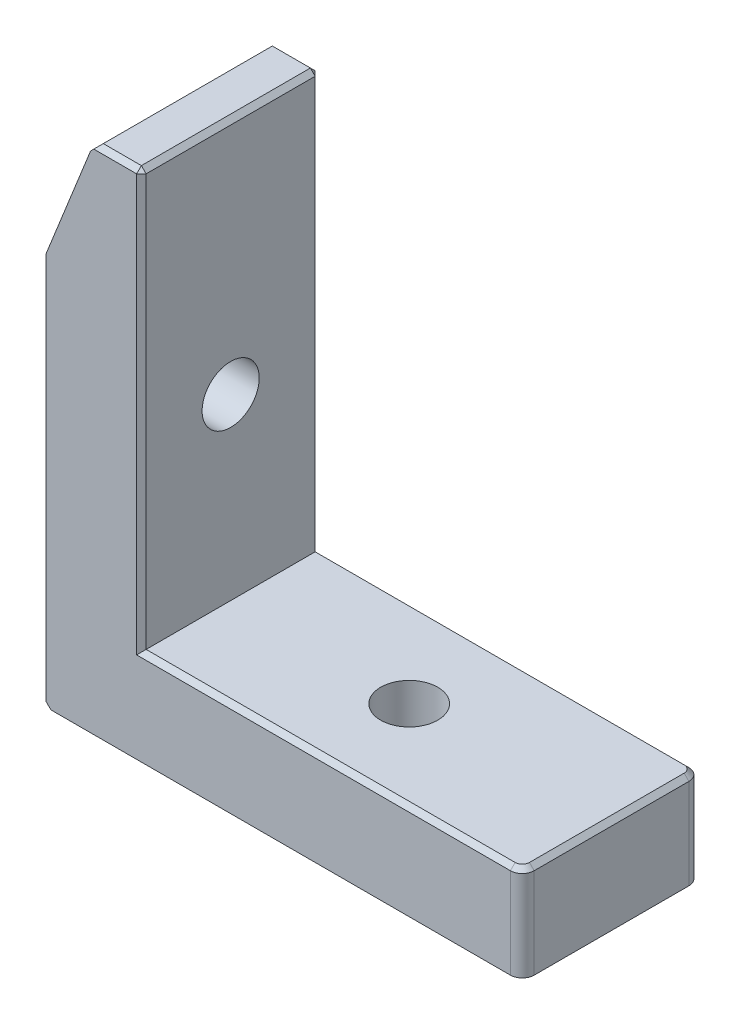
ISO-10303-21;
HEADER;
FILE_DESCRIPTION(('STEP AP214'),'2;1');
FILE_NAME('part.step','',(''),(''),'','','');
FILE_SCHEMA(('AUTOMOTIVE_DESIGN { 1 0 10303 214 1 1 1 1 }'));
ENDSEC;
DATA;
#1=APPLICATION_CONTEXT('core data for automotive mechanical design processes');
#2=APPLICATION_PROTOCOL_DEFINITION('international standard','automotive_design',2000,#1);
#3=PRODUCT_CONTEXT('',#1,'mechanical');
#4=PRODUCT('Part','Part','',(#3));
#5=PRODUCT_RELATED_PRODUCT_CATEGORY('part','',(#4));
#6=PRODUCT_DEFINITION_FORMATION('','',#4);
#7=PRODUCT_DEFINITION_CONTEXT('part definition',#1,'design');
#8=PRODUCT_DEFINITION('design','',#6,#7);
#9=PRODUCT_DEFINITION_SHAPE('','',#8);
#10=(LENGTH_UNIT() NAMED_UNIT(*) SI_UNIT(.MILLI.,.METRE.));
#11=(NAMED_UNIT(*) PLANE_ANGLE_UNIT() SI_UNIT($,.RADIAN.));
#12=(NAMED_UNIT(*) SI_UNIT($,.STERADIAN.) SOLID_ANGLE_UNIT());
#13=UNCERTAINTY_MEASURE_WITH_UNIT(LENGTH_MEASURE(1.E-05),#10,'distance_accuracy_value','');
#14=(GEOMETRIC_REPRESENTATION_CONTEXT(3) GLOBAL_UNCERTAINTY_ASSIGNED_CONTEXT((#13)) GLOBAL_UNIT_ASSIGNED_CONTEXT((#10,
#11,#12)) REPRESENTATION_CONTEXT('',''));
#15=CARTESIAN_POINT('',(0.,0.,0.));
#16=DIRECTION('',(0.,0.,1.));
#17=DIRECTION('',(1.,0.,0.));
#18=AXIS2_PLACEMENT_3D('',#15,#16,#17);
#19=CARTESIAN_POINT('',(40.,0.,7.5));
#20=DIRECTION('',(0.,1.,0.));
#21=DIRECTION('',(-1.,0.,0.));
#22=AXIS2_PLACEMENT_3D('',#19,#20,#21);
#23=PLANE('',#22);
#24=DIRECTION('',(1.,0.,0.));
#25=VECTOR('',#24,1.);
#26=CARTESIAN_POINT('',(40.,0.,7.5));
#27=LINE('',#26,#25);
#28=CARTESIAN_POINT('',(0.400000000000005,0.,7.5));
#29=VERTEX_POINT('',#28);
#30=CARTESIAN_POINT('',(39.,0.,7.5));
#31=VERTEX_POINT('',#30);
#32=EDGE_CURVE('E169',#29,#31,#27,.T.);
#33=ORIENTED_EDGE('',*,*,#32,.F.);
#34=DIRECTION('',(0.,0.,-1.));
#35=VECTOR('',#34,1.);
#36=CARTESIAN_POINT('',(0.400000000000005,0.,7.5));
#37=LINE('',#36,#35);
#38=CARTESIAN_POINT('',(0.400000000000005,0.,-7.5));
#39=VERTEX_POINT('',#38);
#40=EDGE_CURVE('E49',#29,#39,#37,.T.);
#41=ORIENTED_EDGE('',*,*,#40,.T.);
#42=DIRECTION('',(1.,0.,0.));
#43=VECTOR('',#42,1.);
#44=CARTESIAN_POINT('',(40.,0.,-7.5));
#45=LINE('',#44,#43);
#46=CARTESIAN_POINT('',(39.,0.,-7.5));
#47=VERTEX_POINT('',#46);
#48=EDGE_CURVE('E186',#39,#47,#45,.T.);
#49=ORIENTED_EDGE('',*,*,#48,.T.);
#50=CARTESIAN_POINT('',(39.,0.,-6.5));
#51=DIRECTION('',(0.,1.,0.));
#52=DIRECTION('',(-1.,0.,0.));
#53=AXIS2_PLACEMENT_3D('',#50,#51,#52);
#54=CIRCLE('',#53,1.);
#55=CARTESIAN_POINT('',(40.,0.,-6.5));
#56=VERTEX_POINT('',#55);
#57=EDGE_CURVE('E207',#47,#56,#54,.F.);
#58=ORIENTED_EDGE('',*,*,#57,.T.);
#59=DIRECTION('',(0.,0.,-1.));
#60=VECTOR('',#59,1.);
#61=CARTESIAN_POINT('',(40.,0.,7.5));
#62=LINE('',#61,#60);
#63=CARTESIAN_POINT('',(40.,0.,6.5));
#64=VERTEX_POINT('',#63);
#65=EDGE_CURVE('E193',#64,#56,#62,.T.);
#66=ORIENTED_EDGE('',*,*,#65,.F.);
#67=CARTESIAN_POINT('',(39.,0.,6.5));
#68=DIRECTION('',(0.,1.,0.));
#69=DIRECTION('',(-1.,0.,0.));
#70=AXIS2_PLACEMENT_3D('',#67,#68,#69);
#71=CIRCLE('',#70,1.);
#72=EDGE_CURVE('E204',#64,#31,#71,.F.);
#73=ORIENTED_EDGE('',*,*,#72,.T.);
#74=EDGE_LOOP('',(#33,#41,#49,#58,#66,#73));
#75=FACE_BOUND('',#74,.T.);
#76=CARTESIAN_POINT('',(23.,0.,0.));
#77=DIRECTION('',(0.,-1.,0.));
#78=DIRECTION('',(0.,0.,-1.));
#79=AXIS2_PLACEMENT_3D('',#76,#77,#78);
#80=CIRCLE('',#79,4.59);
#81=CARTESIAN_POINT('',(23.,0.,-4.59));
#82=VERTEX_POINT('',#81);
#83=EDGE_CURVE('E321',#82,#82,#80,.T.);
#84=ORIENTED_EDGE('',*,*,#83,.F.);
#85=EDGE_LOOP('',(#84));
#86=FACE_BOUND('',#85,.T.);
#87=ADVANCED_FACE('F39',(#75,#86),#23,.F.);
#88=CARTESIAN_POINT('',(40.,8.,7.5));
#89=DIRECTION('',(-1.,0.,0.));
#90=DIRECTION('',(0.,0.,1.));
#91=AXIS2_PLACEMENT_3D('',#88,#89,#90);
#92=PLANE('',#91);
#93=DIRECTION('',(0.,1.,0.));
#94=VECTOR('',#93,1.);
#95=CARTESIAN_POINT('',(40.,8.,-6.5));
#96=LINE('',#95,#94);
#97=CARTESIAN_POINT('',(40.,7.6,-6.5));
#98=VERTEX_POINT('',#97);
#99=EDGE_CURVE('E198',#56,#98,#96,.T.);
#100=ORIENTED_EDGE('',*,*,#99,.T.);
#101=DIRECTION('',(0.,0.,1.));
#102=VECTOR('',#101,1.);
#103=CARTESIAN_POINT('',(40.,7.6,7.5));
#104=LINE('',#103,#102);
#105=CARTESIAN_POINT('',(40.,7.6,6.5));
#106=VERTEX_POINT('',#105);
#107=EDGE_CURVE('E223',#98,#106,#104,.T.);
#108=ORIENTED_EDGE('',*,*,#107,.T.);
#109=DIRECTION('',(0.,1.,0.));
#110=VECTOR('',#109,1.);
#111=CARTESIAN_POINT('',(40.,8.,6.5));
#112=LINE('',#111,#110);
#113=EDGE_CURVE('E196',#106,#64,#112,.F.);
#114=ORIENTED_EDGE('',*,*,#113,.T.);
#115=ORIENTED_EDGE('',*,*,#65,.T.);
#116=EDGE_LOOP('',(#100,#108,#114,#115));
#117=FACE_BOUND('',#116,.T.);
#118=ADVANCED_FACE('F348',(#117),#92,.F.);
#119=CARTESIAN_POINT('',(8.,8.,7.5));
#120=DIRECTION('',(0.,-1.,0.));
#121=DIRECTION('',(0.,0.,-1.));
#122=AXIS2_PLACEMENT_3D('',#119,#120,#121);
#123=PLANE('',#122);
#124=CARTESIAN_POINT('',(23.,8.,0.));
#125=DIRECTION('',(0.,-1.,0.));
#126=DIRECTION('',(0.,0.,-1.));
#127=AXIS2_PLACEMENT_3D('',#124,#125,#126);
#128=CIRCLE('',#127,2.4);
#129=CARTESIAN_POINT('',(23.,8.,-2.4));
#130=VERTEX_POINT('',#129);
#131=EDGE_CURVE('E188',#130,#130,#128,.T.);
#132=ORIENTED_EDGE('',*,*,#131,.T.);
#133=EDGE_LOOP('',(#132));
#134=FACE_BOUND('',#133,.T.);
#135=CARTESIAN_POINT('',(39.,8.,-6.5));
#136=DIRECTION('',(0.,-1.,0.));
#137=DIRECTION('',(0.,0.,-1.));
#138=AXIS2_PLACEMENT_3D('',#135,#136,#137);
#139=CIRCLE('',#138,0.600000000000002);
#140=CARTESIAN_POINT('',(39.6,8.,-6.5));
#141=VERTEX_POINT('',#140);
#142=CARTESIAN_POINT('',(39.,8.,-7.1));
#143=VERTEX_POINT('',#142);
#144=EDGE_CURVE('E219',#141,#143,#139,.F.);
#145=ORIENTED_EDGE('',*,*,#144,.T.);
#146=DIRECTION('',(-1.,0.,0.));
#147=VECTOR('',#146,1.);
#148=CARTESIAN_POINT('',(8.,8.,-7.1));
#149=LINE('',#148,#147);
#150=CARTESIAN_POINT('',(8.,8.,-7.1));
#151=VERTEX_POINT('',#150);
#152=EDGE_CURVE('E221',#143,#151,#149,.T.);
#153=ORIENTED_EDGE('',*,*,#152,.T.);
#154=DIRECTION('',(0.,0.,-1.));
#155=VECTOR('',#154,1.);
#156=CARTESIAN_POINT('',(8.,8.,7.5));
#157=LINE('',#156,#155);
#158=CARTESIAN_POINT('',(8.,8.,7.1));
#159=VERTEX_POINT('',#158);
#160=EDGE_CURVE('E179',#159,#151,#157,.T.);
#161=ORIENTED_EDGE('',*,*,#160,.F.);
#162=DIRECTION('',(1.,0.,0.));
#163=VECTOR('',#162,1.);
#164=CARTESIAN_POINT('',(8.,8.,7.1));
#165=LINE('',#164,#163);
#166=CARTESIAN_POINT('',(39.,8.,7.1));
#167=VERTEX_POINT('',#166);
#168=EDGE_CURVE('E212',#159,#167,#165,.T.);
#169=ORIENTED_EDGE('',*,*,#168,.T.);
#170=CARTESIAN_POINT('',(39.,8.,6.5));
#171=DIRECTION('',(0.,-1.,0.));
#172=DIRECTION('',(0.,0.,-1.));
#173=AXIS2_PLACEMENT_3D('',#170,#171,#172);
#174=CIRCLE('',#173,0.600000000000003);
#175=CARTESIAN_POINT('',(39.6,8.,6.5));
#176=VERTEX_POINT('',#175);
#177=EDGE_CURVE('E214',#167,#176,#174,.F.);
#178=ORIENTED_EDGE('',*,*,#177,.T.);
#179=DIRECTION('',(0.,0.,-1.));
#180=VECTOR('',#179,1.);
#181=CARTESIAN_POINT('',(39.6,8.,7.5));
#182=LINE('',#181,#180);
#183=EDGE_CURVE('E216',#176,#141,#182,.T.);
#184=ORIENTED_EDGE('',*,*,#183,.T.);
#185=EDGE_LOOP('',(#145,#153,#161,#169,#178,#184));
#186=FACE_BOUND('',#185,.T.);
#187=ADVANCED_FACE('F360',(#134,#186),#123,.F.);
#188=CARTESIAN_POINT('',(8.,43.,7.5));
#189=DIRECTION('',(-1.,0.,0.));
#190=DIRECTION('',(0.,-1.,0.));
#191=AXIS2_PLACEMENT_3D('',#188,#189,#190);
#192=PLANE('',#191);
#193=ORIENTED_EDGE('',*,*,#160,.T.);
#194=DIRECTION('',(0.,1.,0.));
#195=VECTOR('',#194,1.);
#196=CARTESIAN_POINT('',(8.,43.,-7.1));
#197=LINE('',#196,#195);
#198=CARTESIAN_POINT('',(8.,42.6,-7.1));
#199=VERTEX_POINT('',#198);
#200=EDGE_CURVE('E62',#151,#199,#197,.T.);
#201=ORIENTED_EDGE('',*,*,#200,.T.);
#202=DIRECTION('',(0.,0.,1.));
#203=VECTOR('',#202,1.);
#204=CARTESIAN_POINT('',(8.,42.6,7.5));
#205=LINE('',#204,#203);
#206=CARTESIAN_POINT('',(8.,42.6,7.1));
#207=VERTEX_POINT('',#206);
#208=EDGE_CURVE('E57',#199,#207,#205,.T.);
#209=ORIENTED_EDGE('',*,*,#208,.T.);
#210=DIRECTION('',(0.,-1.,0.));
#211=VECTOR('',#210,1.);
#212=CARTESIAN_POINT('',(8.,43.,7.1));
#213=LINE('',#212,#211);
#214=EDGE_CURVE('E261',#207,#159,#213,.T.);
#215=ORIENTED_EDGE('',*,*,#214,.T.);
#216=EDGE_LOOP('',(#193,#201,#209,#215));
#217=FACE_BOUND('',#216,.T.);
#218=CARTESIAN_POINT('',(8.,23.,0.));
#219=DIRECTION('',(-1.,0.,0.));
#220=DIRECTION('',(0.,-1.,0.));
#221=AXIS2_PLACEMENT_3D('',#218,#219,#220);
#222=CIRCLE('',#221,2.39999999999999);
#223=CARTESIAN_POINT('',(8.,20.6,0.));
#224=VERTEX_POINT('',#223);
#225=EDGE_CURVE('E316',#224,#224,#222,.T.);
#226=ORIENTED_EDGE('',*,*,#225,.T.);
#227=EDGE_LOOP('',(#226));
#228=FACE_BOUND('',#227,.T.);
#229=ADVANCED_FACE('F408',(#217,#228),#192,.F.);
#230=CARTESIAN_POINT('',(4.,43.,7.5));
#231=DIRECTION('',(0.,-1.,0.));
#232=DIRECTION('',(0.,0.,-1.));
#233=AXIS2_PLACEMENT_3D('',#230,#231,#232);
#234=PLANE('',#233);
#235=DIRECTION('',(-1.,0.,0.));
#236=VECTOR('',#235,1.);
#237=CARTESIAN_POINT('',(4.,43.,-7.1));
#238=LINE('',#237,#236);
#239=CARTESIAN_POINT('',(7.6,43.,-7.1));
#240=VERTEX_POINT('',#239);
#241=CARTESIAN_POINT('',(4.4,43.,-7.1));
#242=VERTEX_POINT('',#241);
#243=EDGE_CURVE('E242',#240,#242,#238,.T.);
#244=ORIENTED_EDGE('',*,*,#243,.T.);
#245=DIRECTION('',(0.,0.,1.));
#246=VECTOR('',#245,1.);
#247=CARTESIAN_POINT('',(4.4,43.,7.5));
#248=LINE('',#247,#246);
#249=CARTESIAN_POINT('',(4.4,43.,7.1));
#250=VERTEX_POINT('',#249);
#251=EDGE_CURVE('E244',#242,#250,#248,.T.);
#252=ORIENTED_EDGE('',*,*,#251,.T.);
#253=DIRECTION('',(1.,0.,0.));
#254=VECTOR('',#253,1.);
#255=CARTESIAN_POINT('',(4.,43.,7.1));
#256=LINE('',#255,#254);
#257=CARTESIAN_POINT('',(7.6,43.,7.1));
#258=VERTEX_POINT('',#257);
#259=EDGE_CURVE('E240',#250,#258,#256,.T.);
#260=ORIENTED_EDGE('',*,*,#259,.T.);
#261=DIRECTION('',(0.,0.,-1.));
#262=VECTOR('',#261,1.);
#263=CARTESIAN_POINT('',(7.6,43.,7.5));
#264=LINE('',#263,#262);
#265=EDGE_CURVE('E238',#258,#240,#264,.T.);
#266=ORIENTED_EDGE('',*,*,#265,.T.);
#267=EDGE_LOOP('',(#244,#252,#260,#266));
#268=FACE_BOUND('',#267,.T.);
#269=ADVANCED_FACE('F412',(#268),#234,.F.);
#270=CARTESIAN_POINT('',(0.,33.,7.5));
#271=DIRECTION('',(0.928476690885259,-0.371390676354104,0.));
#272=DIRECTION('',(0.371390676354104,0.928476690885259,0.));
#273=AXIS2_PLACEMENT_3D('',#270,#271,#272);
#274=PLANE('',#273);
#275=DIRECTION('',(-0.371390676354104,-0.928476690885259,0.));
#276=VECTOR('',#275,1.);
#277=CARTESIAN_POINT('',(0.,33.,7.5));
#278=LINE('',#277,#276);
#279=CARTESIAN_POINT('',(3.73333333333333,42.3333333333333,7.5));
#280=VERTEX_POINT('',#279);
#281=CARTESIAN_POINT('',(0.,33.,7.5));
#282=VERTEX_POINT('',#281);
#283=EDGE_CURVE('E159',#280,#282,#278,.T.);
#284=ORIENTED_EDGE('',*,*,#283,.F.);
#285=DIRECTION('',(0.,0.,-1.));
#286=VECTOR('',#285,1.);
#287=CARTESIAN_POINT('',(3.73333333333333,42.3333333333333,7.5));
#288=LINE('',#287,#286);
#289=CARTESIAN_POINT('',(3.73333333333333,42.3333333333333,-7.5));
#290=VERTEX_POINT('',#289);
#291=EDGE_CURVE('E226',#280,#290,#288,.T.);
#292=ORIENTED_EDGE('',*,*,#291,.T.);
#293=DIRECTION('',(-0.371390676354104,-0.928476690885259,0.));
#294=VECTOR('',#293,1.);
#295=CARTESIAN_POINT('',(0.,33.,-7.5));
#296=LINE('',#295,#294);
#297=CARTESIAN_POINT('',(0.,33.,-7.5));
#298=VERTEX_POINT('',#297);
#299=EDGE_CURVE('E175',#290,#298,#296,.T.);
#300=ORIENTED_EDGE('',*,*,#299,.T.);
#301=DIRECTION('',(0.,0.,-1.));
#302=VECTOR('',#301,1.);
#303=CARTESIAN_POINT('',(0.,33.,7.5));
#304=LINE('',#303,#302);
#305=EDGE_CURVE('E172',#282,#298,#304,.T.);
#306=ORIENTED_EDGE('',*,*,#305,.F.);
#307=EDGE_LOOP('',(#284,#292,#300,#306));
#308=FACE_BOUND('',#307,.T.);
#309=ADVANCED_FACE('F173',(#308),#274,.F.);
#310=CARTESIAN_POINT('',(0.,0.,7.5));
#311=DIRECTION('',(1.,0.,0.));
#312=DIRECTION('',(0.,0.,-1.));
#313=AXIS2_PLACEMENT_3D('',#310,#311,#312);
#314=PLANE('',#313);
#315=CARTESIAN_POINT('',(0.,23.,0.));
#316=DIRECTION('',(-1.,0.,0.));
#317=DIRECTION('',(0.,0.,1.));
#318=AXIS2_PLACEMENT_3D('',#315,#316,#317);
#319=CIRCLE('',#318,4.59);
#320=CARTESIAN_POINT('',(0.,23.,4.59));
#321=VERTEX_POINT('',#320);
#322=EDGE_CURVE('E306',#321,#321,#319,.T.);
#323=ORIENTED_EDGE('',*,*,#322,.F.);
#324=EDGE_LOOP('',(#323));
#325=FACE_BOUND('',#324,.T.);
#326=DIRECTION('',(0.,-1.,0.));
#327=VECTOR('',#326,1.);
#328=CARTESIAN_POINT('',(0.,0.,-7.5));
#329=LINE('',#328,#327);
#330=CARTESIAN_POINT('',(0.,0.400000000000004,-7.5));
#331=VERTEX_POINT('',#330);
#332=EDGE_CURVE('E190',#298,#331,#329,.T.);
#333=ORIENTED_EDGE('',*,*,#332,.T.);
#334=DIRECTION('',(0.,0.,1.));
#335=VECTOR('',#334,1.);
#336=CARTESIAN_POINT('',(0.,0.400000000000004,7.5));
#337=LINE('',#336,#335);
#338=CARTESIAN_POINT('',(0.,0.400000000000004,7.5));
#339=VERTEX_POINT('',#338);
#340=EDGE_CURVE('E11',#331,#339,#337,.T.);
#341=ORIENTED_EDGE('',*,*,#340,.T.);
#342=DIRECTION('',(0.,-1.,0.));
#343=VECTOR('',#342,1.);
#344=CARTESIAN_POINT('',(0.,0.,7.5));
#345=LINE('',#344,#343);
#346=EDGE_CURVE('E163',#282,#339,#345,.T.);
#347=ORIENTED_EDGE('',*,*,#346,.F.);
#348=ORIENTED_EDGE('',*,*,#305,.T.);
#349=EDGE_LOOP('',(#333,#341,#347,#348));
#350=FACE_BOUND('',#349,.T.);
#351=ADVANCED_FACE('F181',(#325,#350),#314,.F.);
#352=CARTESIAN_POINT('',(0.,0.,7.5));
#353=DIRECTION('',(0.,0.,-1.));
#354=DIRECTION('',(-1.,0.,0.));
#355=AXIS2_PLACEMENT_3D('',#352,#353,#354);
#356=PLANE('',#355);
#357=DIRECTION('',(-1.,0.,0.));
#358=VECTOR('',#357,1.);
#359=CARTESIAN_POINT('',(0.,42.6,7.5));
#360=LINE('',#359,#358);
#361=CARTESIAN_POINT('',(7.6,42.6,7.5));
#362=VERTEX_POINT('',#361);
#363=CARTESIAN_POINT('',(4.,42.6,7.5));
#364=VERTEX_POINT('',#363);
#365=EDGE_CURVE('E249',#362,#364,#360,.T.);
#366=ORIENTED_EDGE('',*,*,#365,.T.);
#367=DIRECTION('',(0.707106781186546,0.707106781186549,0.));
#368=VECTOR('',#367,1.);
#369=CARTESIAN_POINT('',(3.73333333333333,42.3333333333333,7.5));
#370=LINE('',#369,#368);
#371=EDGE_CURVE('E166',#364,#280,#370,.F.);
#372=ORIENTED_EDGE('',*,*,#371,.T.);
#373=ORIENTED_EDGE('',*,*,#283,.T.);
#374=ORIENTED_EDGE('',*,*,#346,.T.);
#375=DIRECTION('',(-0.707106781186548,0.707106781186547,0.));
#376=VECTOR('',#375,1.);
#377=CARTESIAN_POINT('',(0.400000000000005,0.,7.5));
#378=LINE('',#377,#376);
#379=EDGE_CURVE('E247',#339,#29,#378,.F.);
#380=ORIENTED_EDGE('',*,*,#379,.T.);
#381=ORIENTED_EDGE('',*,*,#32,.T.);
#382=DIRECTION('',(0.,1.,0.));
#383=VECTOR('',#382,1.);
#384=CARTESIAN_POINT('',(39.,0.,7.5));
#385=LINE('',#384,#383);
#386=CARTESIAN_POINT('',(39.,7.6,7.5));
#387=VERTEX_POINT('',#386);
#388=EDGE_CURVE('E209',#31,#387,#385,.T.);
#389=ORIENTED_EDGE('',*,*,#388,.T.);
#390=DIRECTION('',(-1.,0.,0.));
#391=VECTOR('',#390,1.);
#392=CARTESIAN_POINT('',(0.,7.6,7.5));
#393=LINE('',#392,#391);
#394=CARTESIAN_POINT('',(7.60000000000001,7.6,7.5));
#395=VERTEX_POINT('',#394);
#396=EDGE_CURVE('E253',#387,#395,#393,.T.);
#397=ORIENTED_EDGE('',*,*,#396,.T.);
#398=DIRECTION('',(0.,1.,0.));
#399=VECTOR('',#398,1.);
#400=CARTESIAN_POINT('',(7.60000000000001,0.,7.5));
#401=LINE('',#400,#399);
#402=EDGE_CURVE('E251',#395,#362,#401,.T.);
#403=ORIENTED_EDGE('',*,*,#402,.T.);
#404=EDGE_LOOP('',(#366,#372,#373,#374,#380,#381,#389,#397,#403));
#405=FACE_BOUND('',#404,.T.);
#406=ADVANCED_FACE('F161',(#405),#356,.F.);
#407=CARTESIAN_POINT('',(0.,0.,-7.5));
#408=DIRECTION('',(0.,0.,-1.));
#409=DIRECTION('',(-1.,0.,0.));
#410=AXIS2_PLACEMENT_3D('',#407,#408,#409);
#411=PLANE('',#410);
#412=ORIENTED_EDGE('',*,*,#299,.F.);
#413=DIRECTION('',(-0.707106781186546,-0.707106781186549,0.));
#414=VECTOR('',#413,1.);
#415=CARTESIAN_POINT('',(-19.3,19.2999999999999,-7.5));
#416=LINE('',#415,#414);
#417=CARTESIAN_POINT('',(4.,42.6,-7.5));
#418=VERTEX_POINT('',#417);
#419=EDGE_CURVE('E236',#290,#418,#416,.F.);
#420=ORIENTED_EDGE('',*,*,#419,.T.);
#421=DIRECTION('',(1.,0.,0.));
#422=VECTOR('',#421,1.);
#423=CARTESIAN_POINT('',(8.,42.6,-7.5));
#424=LINE('',#423,#422);
#425=CARTESIAN_POINT('',(7.6,42.6,-7.5));
#426=VERTEX_POINT('',#425);
#427=EDGE_CURVE('E230',#418,#426,#424,.T.);
#428=ORIENTED_EDGE('',*,*,#427,.T.);
#429=DIRECTION('',(0.,-1.,0.));
#430=VECTOR('',#429,1.);
#431=CARTESIAN_POINT('',(7.60000000000001,8.,-7.5));
#432=LINE('',#431,#430);
#433=CARTESIAN_POINT('',(7.60000000000001,7.6,-7.5));
#434=VERTEX_POINT('',#433);
#435=EDGE_CURVE('E232',#426,#434,#432,.T.);
#436=ORIENTED_EDGE('',*,*,#435,.T.);
#437=DIRECTION('',(1.,0.,0.));
#438=VECTOR('',#437,1.);
#439=CARTESIAN_POINT('',(39.,7.6,-7.5));
#440=LINE('',#439,#438);
#441=CARTESIAN_POINT('',(39.,7.6,-7.5));
#442=VERTEX_POINT('',#441);
#443=EDGE_CURVE('E234',#434,#442,#440,.T.);
#444=ORIENTED_EDGE('',*,*,#443,.T.);
#445=DIRECTION('',(0.,1.,0.));
#446=VECTOR('',#445,1.);
#447=CARTESIAN_POINT('',(39.,0.,-7.5));
#448=LINE('',#447,#446);
#449=EDGE_CURVE('E201',#442,#47,#448,.F.);
#450=ORIENTED_EDGE('',*,*,#449,.T.);
#451=ORIENTED_EDGE('',*,*,#48,.F.);
#452=DIRECTION('',(0.707106781186548,-0.707106781186547,0.));
#453=VECTOR('',#452,1.);
#454=CARTESIAN_POINT('',(0.200000000000002,0.200000000000002,-7.5));
#455=LINE('',#454,#453);
#456=EDGE_CURVE('E228',#39,#331,#455,.F.);
#457=ORIENTED_EDGE('',*,*,#456,.T.);
#458=ORIENTED_EDGE('',*,*,#332,.F.);
#459=EDGE_LOOP('',(#412,#420,#428,#436,#444,#450,#451,#457,#458));
#460=FACE_BOUND('',#459,.T.);
#461=ADVANCED_FACE('F380',(#460),#411,.T.);
#462=CARTESIAN_POINT('',(23.,0.,0.));
#463=DIRECTION('',(0.,-1.,0.));
#464=DIRECTION('',(0.,0.,-1.));
#465=AXIS2_PLACEMENT_3D('',#462,#463,#464);
#466=CYLINDRICAL_SURFACE('',#465,2.4);
#467=ORIENTED_EDGE('',*,*,#131,.F.);
#468=EDGE_LOOP('',(#467));
#469=FACE_BOUND('',#468,.T.);
#470=CARTESIAN_POINT('',(23.,2.19,0.));
#471=DIRECTION('',(0.,-1.,0.));
#472=DIRECTION('',(0.,0.,-1.));
#473=AXIS2_PLACEMENT_3D('',#470,#471,#472);
#474=CIRCLE('',#473,2.4);
#475=CARTESIAN_POINT('',(23.,2.19,-2.4));
#476=VERTEX_POINT('',#475);
#477=EDGE_CURVE('E324',#476,#476,#474,.T.);
#478=ORIENTED_EDGE('',*,*,#477,.T.);
#479=EDGE_LOOP('',(#478));
#480=FACE_BOUND('',#479,.T.);
#481=ADVANCED_FACE('F423',(#469,#480),#466,.F.);
#482=CARTESIAN_POINT('',(23.,0.,0.));
#483=DIRECTION('',(0.,-1.,0.));
#484=DIRECTION('',(0.,0.,-1.));
#485=AXIS2_PLACEMENT_3D('',#482,#483,#484);
#486=CONICAL_SURFACE('',#485,4.59,0.785398163397448);
#487=ORIENTED_EDGE('',*,*,#477,.F.);
#488=EDGE_LOOP('',(#487));
#489=FACE_BOUND('',#488,.T.);
#490=ORIENTED_EDGE('',*,*,#83,.T.);
#491=EDGE_LOOP('',(#490));
#492=FACE_BOUND('',#491,.T.);
#493=ADVANCED_FACE('F428',(#489,#492),#486,.F.);
#494=CARTESIAN_POINT('',(0.,23.,0.));
#495=DIRECTION('',(-1.,0.,0.));
#496=DIRECTION('',(0.,0.,1.));
#497=AXIS2_PLACEMENT_3D('',#494,#495,#496);
#498=CYLINDRICAL_SURFACE('',#497,2.39999999999999);
#499=ORIENTED_EDGE('',*,*,#225,.F.);
#500=EDGE_LOOP('',(#499));
#501=FACE_BOUND('',#500,.T.);
#502=CARTESIAN_POINT('',(2.19,23.,0.));
#503=DIRECTION('',(-1.,0.,0.));
#504=DIRECTION('',(0.,0.,1.));
#505=AXIS2_PLACEMENT_3D('',#502,#503,#504);
#506=CIRCLE('',#505,2.39999999999999);
#507=CARTESIAN_POINT('',(2.19,23.,2.39999999999999));
#508=VERTEX_POINT('',#507);
#509=EDGE_CURVE('E311',#508,#508,#506,.T.);
#510=ORIENTED_EDGE('',*,*,#509,.T.);
#511=EDGE_LOOP('',(#510));
#512=FACE_BOUND('',#511,.T.);
#513=ADVANCED_FACE('F396',(#501,#512),#498,.F.);
#514=CARTESIAN_POINT('',(0.,23.,0.));
#515=DIRECTION('',(-1.,0.,0.));
#516=DIRECTION('',(0.,0.,1.));
#517=AXIS2_PLACEMENT_3D('',#514,#515,#516);
#518=CONICAL_SURFACE('',#517,4.59,0.785398163397452);
#519=ORIENTED_EDGE('',*,*,#509,.F.);
#520=EDGE_LOOP('',(#519));
#521=FACE_BOUND('',#520,.T.);
#522=ORIENTED_EDGE('',*,*,#322,.T.);
#523=EDGE_LOOP('',(#522));
#524=FACE_BOUND('',#523,.T.);
#525=ADVANCED_FACE('F389',(#521,#524),#518,.F.);
#526=CARTESIAN_POINT('',(39.,8.,-6.5));
#527=DIRECTION('',(0.,-1.,0.));
#528=DIRECTION('',(0.,0.,-1.));
#529=AXIS2_PLACEMENT_3D('',#526,#527,#528);
#530=CYLINDRICAL_SURFACE('',#529,1.);
#531=ORIENTED_EDGE('',*,*,#449,.F.);
#532=CARTESIAN_POINT('',(39.,7.6,-6.5));
#533=DIRECTION('',(0.,-1.,0.));
#534=DIRECTION('',(0.,0.,-1.));
#535=AXIS2_PLACEMENT_3D('',#532,#533,#534);
#536=CIRCLE('',#535,1.);
#537=EDGE_CURVE('E256',#442,#98,#536,.T.);
#538=ORIENTED_EDGE('',*,*,#537,.T.);
#539=ORIENTED_EDGE('',*,*,#99,.F.);
#540=ORIENTED_EDGE('',*,*,#57,.F.);
#541=EDGE_LOOP('',(#531,#538,#539,#540));
#542=FACE_BOUND('',#541,.T.);
#543=ADVANCED_FACE('F387',(#542),#530,.T.);
#544=CARTESIAN_POINT('',(39.,0.,6.5));
#545=DIRECTION('',(0.,1.,0.));
#546=DIRECTION('',(0.,0.,1.));
#547=AXIS2_PLACEMENT_3D('',#544,#545,#546);
#548=CYLINDRICAL_SURFACE('',#547,1.);
#549=ORIENTED_EDGE('',*,*,#113,.F.);
#550=CARTESIAN_POINT('',(39.,7.6,6.5));
#551=DIRECTION('',(0.,-1.,0.));
#552=DIRECTION('',(0.,0.,-1.));
#553=AXIS2_PLACEMENT_3D('',#550,#551,#552);
#554=CIRCLE('',#553,1.);
#555=EDGE_CURVE('E258',#106,#387,#554,.T.);
#556=ORIENTED_EDGE('',*,*,#555,.T.);
#557=ORIENTED_EDGE('',*,*,#388,.F.);
#558=ORIENTED_EDGE('',*,*,#72,.F.);
#559=EDGE_LOOP('',(#549,#556,#557,#558));
#560=FACE_BOUND('',#559,.T.);
#561=ADVANCED_FACE('F338',(#560),#548,.T.);
#562=CARTESIAN_POINT('',(3.73333333333333,42.3333333333333,7.5));
#563=DIRECTION('',(0.707106781186549,-0.707106781186546,0.));
#564=DIRECTION('',(0.,0.,-1.));
#565=AXIS2_PLACEMENT_3D('',#562,#563,#564);
#566=PLANE('',#565);
#567=ORIENTED_EDGE('',*,*,#291,.F.);
#568=ORIENTED_EDGE('',*,*,#371,.F.);
#569=DIRECTION('',(-0.577350269189625,-0.577350269189626,0.577350269189626));
#570=VECTOR('',#569,1.);
#571=CARTESIAN_POINT('',(2.66666666666667,41.2666666666667,8.83333333333333));
#572=LINE('',#571,#570);
#573=EDGE_CURVE('E44',#250,#364,#572,.T.);
#574=ORIENTED_EDGE('',*,*,#573,.F.);
#575=ORIENTED_EDGE('',*,*,#251,.F.);
#576=DIRECTION('',(-0.577350269189625,-0.577350269189626,-0.577350269189626));
#577=VECTOR('',#576,1.);
#578=CARTESIAN_POINT('',(4.26666666666667,42.8666666666667,-7.23333333333334));
#579=LINE('',#578,#577);
#580=EDGE_CURVE('E299',#418,#242,#579,.F.);
#581=ORIENTED_EDGE('',*,*,#580,.F.);
#582=ORIENTED_EDGE('',*,*,#419,.F.);
#583=EDGE_LOOP('',(#567,#568,#574,#575,#581,#582));
#584=FACE_BOUND('',#583,.T.);
#585=ADVANCED_FACE('F376',(#584),#566,.F.);
#586=CARTESIAN_POINT('',(0.,42.6,7.5));
#587=DIRECTION('',(0.,-0.707106781186548,-0.707106781186548));
#588=DIRECTION('',(-1.,0.,0.));
#589=AXIS2_PLACEMENT_3D('',#586,#587,#588);
#590=PLANE('',#589);
#591=ORIENTED_EDGE('',*,*,#573,.T.);
#592=ORIENTED_EDGE('',*,*,#365,.F.);
#593=DIRECTION('',(0.,0.707106781186547,-0.707106781186547));
#594=VECTOR('',#593,1.);
#595=CARTESIAN_POINT('',(7.6,42.6,7.5));
#596=LINE('',#595,#594);
#597=EDGE_CURVE('E297',#258,#362,#596,.F.);
#598=ORIENTED_EDGE('',*,*,#597,.F.);
#599=ORIENTED_EDGE('',*,*,#259,.F.);
#600=EDGE_LOOP('',(#591,#592,#598,#599));
#601=FACE_BOUND('',#600,.T.);
#602=ADVANCED_FACE('F374',(#601),#590,.F.);
#603=CARTESIAN_POINT('',(7.6,43.,7.5));
#604=DIRECTION('',(-0.707106781186548,-0.707106781186548,0.));
#605=DIRECTION('',(0.,0.,-1.));
#606=AXIS2_PLACEMENT_3D('',#603,#604,#605);
#607=PLANE('',#606);
#608=DIRECTION('',(-0.707106781186547,0.707106781186547,0.));
#609=VECTOR('',#608,1.);
#610=CARTESIAN_POINT('',(8.,42.6,-7.1));
#611=LINE('',#610,#609);
#612=EDGE_CURVE('E291',#240,#199,#611,.F.);
#613=ORIENTED_EDGE('',*,*,#612,.F.);
#614=ORIENTED_EDGE('',*,*,#265,.F.);
#615=DIRECTION('',(0.707106781186547,-0.707106781186547,0.));
#616=VECTOR('',#615,1.);
#617=CARTESIAN_POINT('',(7.8,42.8,7.1));
#618=LINE('',#617,#616);
#619=EDGE_CURVE('E294',#207,#258,#618,.F.);
#620=ORIENTED_EDGE('',*,*,#619,.F.);
#621=ORIENTED_EDGE('',*,*,#208,.F.);
#622=EDGE_LOOP('',(#613,#614,#620,#621));
#623=FACE_BOUND('',#622,.T.);
#624=ADVANCED_FACE('F538',(#623),#607,.F.);
#625=CARTESIAN_POINT('',(4.,43.,-7.1));
#626=DIRECTION('',(0.,0.707106781186548,-0.707106781186548));
#627=DIRECTION('',(1.,0.,0.));
#628=AXIS2_PLACEMENT_3D('',#625,#626,#627);
#629=PLANE('',#628);
#630=ORIENTED_EDGE('',*,*,#580,.T.);
#631=ORIENTED_EDGE('',*,*,#243,.F.);
#632=DIRECTION('',(0.,0.707106781186547,0.707106781186547));
#633=VECTOR('',#632,1.);
#634=CARTESIAN_POINT('',(7.6,42.8,-7.3));
#635=LINE('',#634,#633);
#636=EDGE_CURVE('E288',#426,#240,#635,.T.);
#637=ORIENTED_EDGE('',*,*,#636,.F.);
#638=ORIENTED_EDGE('',*,*,#427,.F.);
#639=EDGE_LOOP('',(#630,#631,#637,#638));
#640=FACE_BOUND('',#639,.T.);
#641=ADVANCED_FACE('F548',(#640),#629,.T.);
#642=CARTESIAN_POINT('',(7.6,42.6,7.5));
#643=DIRECTION('',(0.577350269189626,0.577350269189626,0.577350269189626));
#644=DIRECTION('',(0.707106781186548,0.,-0.707106781186548));
#645=AXIS2_PLACEMENT_3D('',#642,#643,#644);
#646=PLANE('',#645);
#647=ORIENTED_EDGE('',*,*,#619,.T.);
#648=ORIENTED_EDGE('',*,*,#597,.T.);
#649=DIRECTION('',(-0.707106781186547,0.,0.707106781186548));
#650=VECTOR('',#649,1.);
#651=CARTESIAN_POINT('',(7.6,42.6,7.5));
#652=LINE('',#651,#650);
#653=EDGE_CURVE('E285',#207,#362,#652,.T.);
#654=ORIENTED_EDGE('',*,*,#653,.F.);
#655=EDGE_LOOP('',(#647,#648,#654));
#656=FACE_BOUND('',#655,.T.);
#657=ADVANCED_FACE('F372',(#656),#646,.T.);
#658=CARTESIAN_POINT('',(8.,42.6,-7.1));
#659=DIRECTION('',(0.577350269189626,0.577350269189626,-0.577350269189626));
#660=DIRECTION('',(-0.707106781186548,0.,-0.707106781186548));
#661=AXIS2_PLACEMENT_3D('',#658,#659,#660);
#662=PLANE('',#661);
#663=ORIENTED_EDGE('',*,*,#636,.T.);
#664=ORIENTED_EDGE('',*,*,#612,.T.);
#665=DIRECTION('',(-0.707106781186547,0.,-0.707106781186548));
#666=VECTOR('',#665,1.);
#667=CARTESIAN_POINT('',(8.,42.6,-7.1));
#668=LINE('',#667,#666);
#669=EDGE_CURVE('E282',#426,#199,#668,.F.);
#670=ORIENTED_EDGE('',*,*,#669,.F.);
#671=EDGE_LOOP('',(#663,#664,#670));
#672=FACE_BOUND('',#671,.T.);
#673=ADVANCED_FACE('F568',(#672),#662,.T.);
#674=CARTESIAN_POINT('',(7.60000000000001,0.,7.5));
#675=DIRECTION('',(-0.707106781186548,0.,-0.707106781186547));
#676=DIRECTION('',(0.,1.,0.));
#677=AXIS2_PLACEMENT_3D('',#674,#675,#676);
#678=PLANE('',#677);
#679=ORIENTED_EDGE('',*,*,#653,.T.);
#680=ORIENTED_EDGE('',*,*,#402,.F.);
#681=DIRECTION('',(0.577350269189626,0.577350269189626,-0.577350269189626));
#682=VECTOR('',#681,1.);
#683=CARTESIAN_POINT('',(5.06666666666667,5.06666666666667,10.0333333333333));
#684=LINE('',#683,#682);
#685=EDGE_CURVE('E279',#159,#395,#684,.F.);
#686=ORIENTED_EDGE('',*,*,#685,.F.);
#687=ORIENTED_EDGE('',*,*,#214,.F.);
#688=EDGE_LOOP('',(#679,#680,#686,#687));
#689=FACE_BOUND('',#688,.T.);
#690=ADVANCED_FACE('F368',(#689),#678,.F.);
#691=CARTESIAN_POINT('',(8.,43.,-7.1));
#692=DIRECTION('',(0.707106781186548,0.,-0.707106781186547));
#693=DIRECTION('',(0.,-1.,0.));
#694=AXIS2_PLACEMENT_3D('',#691,#692,#693);
#695=PLANE('',#694);
#696=ORIENTED_EDGE('',*,*,#669,.T.);
#697=ORIENTED_EDGE('',*,*,#200,.F.);
#698=DIRECTION('',(-0.577350269189626,-0.577350269189626,-0.577350269189626));
#699=VECTOR('',#698,1.);
#700=CARTESIAN_POINT('',(8.,8.,-7.1));
#701=LINE('',#700,#699);
#702=EDGE_CURVE('E276',#434,#151,#701,.F.);
#703=ORIENTED_EDGE('',*,*,#702,.F.);
#704=ORIENTED_EDGE('',*,*,#435,.F.);
#705=EDGE_LOOP('',(#696,#697,#703,#704));
#706=FACE_BOUND('',#705,.T.);
#707=ADVANCED_FACE('F588',(#706),#695,.T.);
#708=CARTESIAN_POINT('',(0.,7.6,7.5));
#709=DIRECTION('',(0.,-0.707106781186548,-0.707106781186548));
#710=DIRECTION('',(-1.,0.,0.));
#711=AXIS2_PLACEMENT_3D('',#708,#709,#710);
#712=PLANE('',#711);
#713=ORIENTED_EDGE('',*,*,#685,.T.);
#714=ORIENTED_EDGE('',*,*,#396,.F.);
#715=DIRECTION('',(0.,-0.707106781186548,0.707106781186548));
#716=VECTOR('',#715,1.);
#717=CARTESIAN_POINT('',(39.,8.,7.1));
#718=LINE('',#717,#716);
#719=EDGE_CURVE('E273',#167,#387,#718,.T.);
#720=ORIENTED_EDGE('',*,*,#719,.F.);
#721=ORIENTED_EDGE('',*,*,#168,.F.);
#722=EDGE_LOOP('',(#713,#714,#720,#721));
#723=FACE_BOUND('',#722,.T.);
#724=ADVANCED_FACE('F365',(#723),#712,.F.);
#725=CARTESIAN_POINT('',(8.,8.,-7.1));
#726=DIRECTION('',(0.,0.707106781186548,-0.707106781186548));
#727=DIRECTION('',(1.,0.,0.));
#728=AXIS2_PLACEMENT_3D('',#725,#726,#727);
#729=PLANE('',#728);
#730=ORIENTED_EDGE('',*,*,#702,.T.);
#731=ORIENTED_EDGE('',*,*,#152,.F.);
#732=DIRECTION('',(0.,0.707106781186548,0.707106781186548));
#733=VECTOR('',#732,1.);
#734=CARTESIAN_POINT('',(39.,7.6,-7.5));
#735=LINE('',#734,#733);
#736=EDGE_CURVE('E270',#442,#143,#735,.T.);
#737=ORIENTED_EDGE('',*,*,#736,.F.);
#738=ORIENTED_EDGE('',*,*,#443,.F.);
#739=EDGE_LOOP('',(#730,#731,#737,#738));
#740=FACE_BOUND('',#739,.T.);
#741=ADVANCED_FACE('F608',(#740),#729,.T.);
#742=CARTESIAN_POINT('',(39.,8.,6.5));
#743=DIRECTION('',(0.,-1.,0.));
#744=DIRECTION('',(0.,0.,-1.));
#745=AXIS2_PLACEMENT_3D('',#742,#743,#744);
#746=CONICAL_SURFACE('',#745,0.600000000000003,0.785398163397447);
#747=ORIENTED_EDGE('',*,*,#719,.T.);
#748=ORIENTED_EDGE('',*,*,#555,.F.);
#749=DIRECTION('',(0.707106781186548,-0.707106781186548,0.));
#750=VECTOR('',#749,1.);
#751=CARTESIAN_POINT('',(39.6,8.,6.5));
#752=LINE('',#751,#750);
#753=EDGE_CURVE('E268',#176,#106,#752,.T.);
#754=ORIENTED_EDGE('',*,*,#753,.F.);
#755=ORIENTED_EDGE('',*,*,#177,.F.);
#756=EDGE_LOOP('',(#747,#748,#754,#755));
#757=FACE_BOUND('',#756,.T.);
#758=ADVANCED_FACE('F342',(#757),#746,.T.);
#759=CARTESIAN_POINT('',(39.,8.,-6.5));
#760=DIRECTION('',(0.,-1.,0.));
#761=DIRECTION('',(0.,0.,-1.));
#762=AXIS2_PLACEMENT_3D('',#759,#760,#761);
#763=CONICAL_SURFACE('',#762,0.600000000000002,0.785398163397448);
#764=ORIENTED_EDGE('',*,*,#736,.T.);
#765=ORIENTED_EDGE('',*,*,#144,.F.);
#766=DIRECTION('',(-0.707106781186548,0.707106781186548,0.));
#767=VECTOR('',#766,1.);
#768=CARTESIAN_POINT('',(40.,7.6,-6.5));
#769=LINE('',#768,#767);
#770=EDGE_CURVE('E266',#98,#141,#769,.T.);
#771=ORIENTED_EDGE('',*,*,#770,.F.);
#772=ORIENTED_EDGE('',*,*,#537,.F.);
#773=EDGE_LOOP('',(#764,#765,#771,#772));
#774=FACE_BOUND('',#773,.T.);
#775=ADVANCED_FACE('F356',(#774),#763,.T.);
#776=CARTESIAN_POINT('',(39.6,8.,7.5));
#777=DIRECTION('',(-0.707106781186554,-0.707106781186541,0.));
#778=DIRECTION('',(0.,0.,-1.));
#779=AXIS2_PLACEMENT_3D('',#776,#777,#778);
#780=PLANE('',#779);
#781=ORIENTED_EDGE('',*,*,#753,.T.);
#782=ORIENTED_EDGE('',*,*,#107,.F.);
#783=ORIENTED_EDGE('',*,*,#770,.T.);
#784=ORIENTED_EDGE('',*,*,#183,.F.);
#785=EDGE_LOOP('',(#781,#782,#783,#784));
#786=FACE_BOUND('',#785,.T.);
#787=ADVANCED_FACE('F352',(#786),#780,.F.);
#788=CARTESIAN_POINT('',(0.400000000000005,0.,7.5));
#789=DIRECTION('',(0.707106781186547,0.707106781186547,0.));
#790=DIRECTION('',(0.,0.,-1.));
#791=AXIS2_PLACEMENT_3D('',#788,#789,#790);
#792=PLANE('',#791);
#793=ORIENTED_EDGE('',*,*,#379,.F.);
#794=ORIENTED_EDGE('',*,*,#340,.F.);
#795=ORIENTED_EDGE('',*,*,#456,.F.);
#796=ORIENTED_EDGE('',*,*,#40,.F.);
#797=EDGE_LOOP('',(#793,#794,#795,#796));
#798=FACE_BOUND('',#797,.T.);
#799=ADVANCED_FACE('F42',(#798),#792,.F.);
#800=CLOSED_SHELL('',(#87,#118,#187,#229,#269,#309,#351,#406,#461,#481,#493,#513,#525,#543,#561,
#585,#602,#624,#641,#657,#673,#690,#707,#724,#741,#758,#775,#787,#799));
#801=MANIFOLD_SOLID_BREP('B2',#800);
#802=ADVANCED_BREP_SHAPE_REPRESENTATION('',(#18,#801),#14);
#803=SHAPE_DEFINITION_REPRESENTATION(#9,#802);
ENDSEC;
END-ISO-10303-21;
